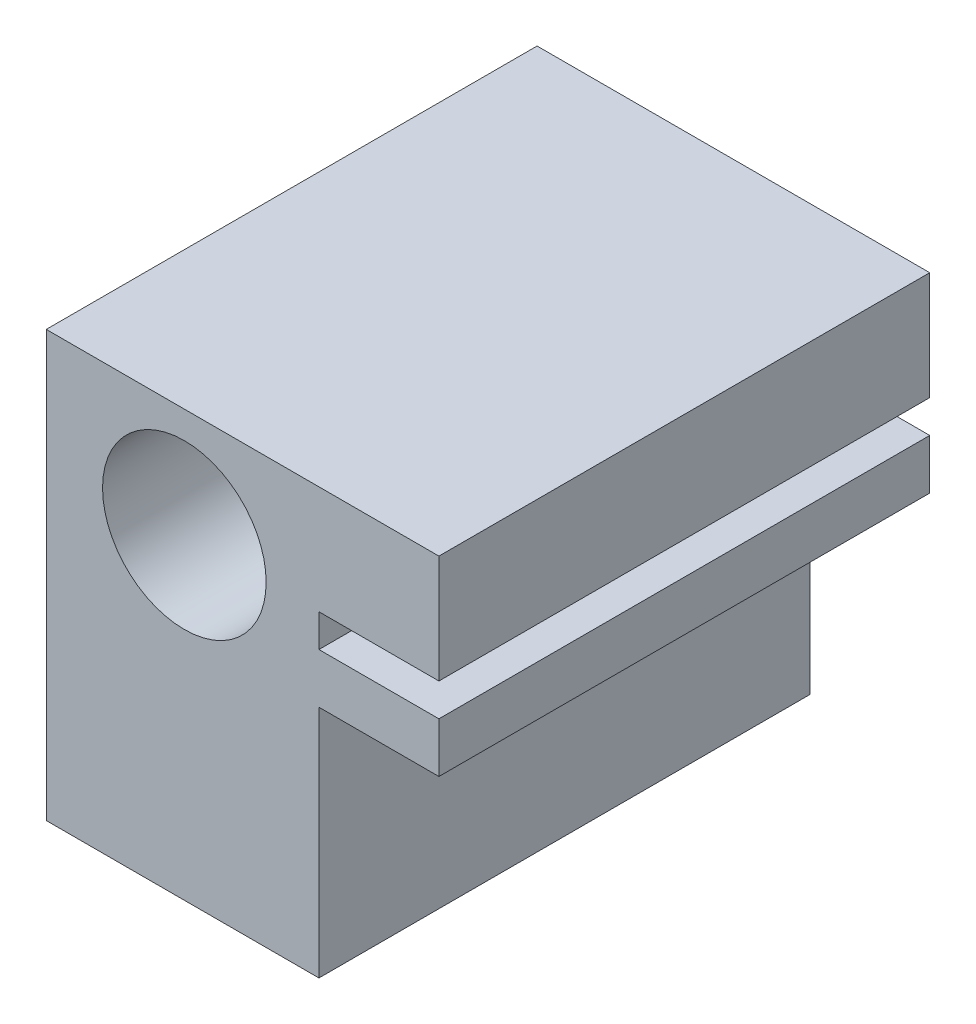
ISO-10303-21;
HEADER;
FILE_DESCRIPTION(('STEP AP214'),'2;1');
FILE_NAME('part.step','',(''),(''),'','','');
FILE_SCHEMA(('AUTOMOTIVE_DESIGN { 1 0 10303 214 1 1 1 1 }'));
ENDSEC;
DATA;
#1=APPLICATION_CONTEXT('core data for automotive mechanical design processes');
#2=APPLICATION_PROTOCOL_DEFINITION('international standard','automotive_design',2000,#1);
#3=PRODUCT_CONTEXT('',#1,'mechanical');
#4=PRODUCT('Part','Part','',(#3));
#5=PRODUCT_RELATED_PRODUCT_CATEGORY('part','',(#4));
#6=PRODUCT_DEFINITION_FORMATION('','',#4);
#7=PRODUCT_DEFINITION_CONTEXT('part definition',#1,'design');
#8=PRODUCT_DEFINITION('design','',#6,#7);
#9=PRODUCT_DEFINITION_SHAPE('','',#8);
#10=(LENGTH_UNIT() NAMED_UNIT(*) SI_UNIT(.MILLI.,.METRE.));
#11=(NAMED_UNIT(*) PLANE_ANGLE_UNIT() SI_UNIT($,.RADIAN.));
#12=(NAMED_UNIT(*) SI_UNIT($,.STERADIAN.) SOLID_ANGLE_UNIT());
#13=UNCERTAINTY_MEASURE_WITH_UNIT(LENGTH_MEASURE(1.E-05),#10,'distance_accuracy_value','');
#14=(GEOMETRIC_REPRESENTATION_CONTEXT(3) GLOBAL_UNCERTAINTY_ASSIGNED_CONTEXT((#13)) GLOBAL_UNIT_ASSIGNED_CONTEXT((#10,
#11,#12)) REPRESENTATION_CONTEXT('',''));
#15=CARTESIAN_POINT('',(0.,0.,0.));
#16=DIRECTION('',(0.,0.,1.));
#17=DIRECTION('',(1.,0.,0.));
#18=AXIS2_PLACEMENT_3D('',#15,#16,#17);
#19=CARTESIAN_POINT('',(16.,0.,0.));
#20=DIRECTION('',(-1.,0.,0.));
#21=DIRECTION('',(0.,-1.,0.));
#22=AXIS2_PLACEMENT_3D('',#19,#20,#21);
#23=PLANE('',#22);
#24=DIRECTION('',(0.,1.,0.));
#25=VECTOR('',#24,1.);
#26=CARTESIAN_POINT('',(16.,0.,-45.));
#27=LINE('',#26,#25);
#28=CARTESIAN_POINT('',(16.,19.0799999999999,-45.));
#29=VERTEX_POINT('',#28);
#30=CARTESIAN_POINT('',(16.,29.,-45.));
#31=VERTEX_POINT('',#30);
#32=EDGE_CURVE('E155',#29,#31,#27,.T.);
#33=ORIENTED_EDGE('',*,*,#32,.T.);
#34=DIRECTION('',(0.,0.,1.));
#35=VECTOR('',#34,1.);
#36=CARTESIAN_POINT('',(16.,29.,-45.));
#37=LINE('',#36,#35);
#38=CARTESIAN_POINT('',(16.,29.,0.));
#39=VERTEX_POINT('',#38);
#40=EDGE_CURVE('E40',#31,#39,#37,.T.);
#41=ORIENTED_EDGE('',*,*,#40,.T.);
#42=DIRECTION('',(0.,1.,0.));
#43=VECTOR('',#42,1.);
#44=CARTESIAN_POINT('',(16.,0.,0.));
#45=LINE('',#44,#43);
#46=CARTESIAN_POINT('',(16.,19.0799999999999,0.));
#47=VERTEX_POINT('',#46);
#48=EDGE_CURVE('E151',#47,#39,#45,.T.);
#49=ORIENTED_EDGE('',*,*,#48,.F.);
#50=DIRECTION('',(0.,0.,-1.));
#51=VECTOR('',#50,1.);
#52=CARTESIAN_POINT('',(16.,19.0799999999999,0.));
#53=LINE('',#52,#51);
#54=EDGE_CURVE('E11',#47,#29,#53,.T.);
#55=ORIENTED_EDGE('',*,*,#54,.T.);
#56=EDGE_LOOP('',(#33,#41,#49,#55));
#57=FACE_BOUND('',#56,.T.);
#58=ADVANCED_FACE('F36',(#57),#23,.F.);
#59=DIRECTION('',(0.,0.,-1.));
#60=VECTOR('',#59,1.);
#61=CARTESIAN_POINT('',(16.,11.4999999999999,0.));
#62=LINE('',#61,#60);
#63=CARTESIAN_POINT('',(16.,11.4999999999999,0.));
#64=VERTEX_POINT('',#63);
#65=CARTESIAN_POINT('',(16.,11.4999999999999,-45.));
#66=VERTEX_POINT('',#65);
#67=EDGE_CURVE('E45',#64,#66,#62,.T.);
#68=ORIENTED_EDGE('',*,*,#67,.T.);
#69=CARTESIAN_POINT('',(16.,16.0799999999999,-45.));
#70=VERTEX_POINT('',#69);
#71=EDGE_CURVE('E156',#66,#70,#27,.T.);
#72=ORIENTED_EDGE('',*,*,#71,.T.);
#73=DIRECTION('',(0.,0.,-1.));
#74=VECTOR('',#73,1.);
#75=CARTESIAN_POINT('',(16.,16.0799999999999,0.));
#76=LINE('',#75,#74);
#77=CARTESIAN_POINT('',(16.,16.0799999999999,0.));
#78=VERTEX_POINT('',#77);
#79=EDGE_CURVE('E204',#78,#70,#76,.T.);
#80=ORIENTED_EDGE('',*,*,#79,.F.);
#81=EDGE_CURVE('E157',#64,#78,#45,.T.);
#82=ORIENTED_EDGE('',*,*,#81,.F.);
#83=EDGE_LOOP('',(#68,#72,#80,#82));
#84=FACE_BOUND('',#83,.T.);
#85=ADVANCED_FACE('F38',(#84),#23,.F.);
#86=CARTESIAN_POINT('',(-7.33999999999951,6.99999999999999,-33.75));
#87=DIRECTION('',(0.,-1.,0.));
#88=DIRECTION('',(1.,0.,0.));
#89=AXIS2_PLACEMENT_3D('',#86,#87,#88);
#90=PLANE('',#89);
#91=CARTESIAN_POINT('',(-7.33999999999951,6.99999999999999,-33.75));
#92=DIRECTION('',(0.,-1.,0.));
#93=DIRECTION('',(1.,0.,0.));
#94=AXIS2_PLACEMENT_3D('',#91,#92,#93);
#95=CIRCLE('',#94,4.);
#96=CARTESIAN_POINT('',(-3.33999999999951,6.99999999999999,-33.75));
#97=VERTEX_POINT('',#96);
#98=EDGE_CURVE('E187',#97,#97,#95,.T.);
#99=ORIENTED_EDGE('',*,*,#98,.T.);
#100=EDGE_LOOP('',(#99));
#101=FACE_BOUND('',#100,.T.);
#102=ADVANCED_FACE('F247',(#101),#90,.T.);
#103=CARTESIAN_POINT('',(-7.33999999999951,6.99999999999999,-11.25));
#104=DIRECTION('',(0.,-1.,0.));
#105=DIRECTION('',(1.,0.,0.));
#106=AXIS2_PLACEMENT_3D('',#103,#104,#105);
#107=PLANE('',#106);
#108=CARTESIAN_POINT('',(-7.33999999999951,6.99999999999999,-11.25));
#109=DIRECTION('',(0.,-1.,0.));
#110=DIRECTION('',(1.,0.,0.));
#111=AXIS2_PLACEMENT_3D('',#108,#109,#110);
#112=CIRCLE('',#111,4.);
#113=CARTESIAN_POINT('',(-3.33999999999952,6.99999999999999,-11.25));
#114=VERTEX_POINT('',#113);
#115=EDGE_CURVE('E184',#114,#114,#112,.T.);
#116=ORIENTED_EDGE('',*,*,#115,.T.);
#117=EDGE_LOOP('',(#116));
#118=FACE_BOUND('',#117,.T.);
#119=ADVANCED_FACE('F312',(#118),#107,.T.);
#120=CARTESIAN_POINT('',(-7.33999999999951,6.99999999999999,-33.75));
#121=DIRECTION('',(0.,-1.,0.));
#122=DIRECTION('',(1.,0.,0.));
#123=AXIS2_PLACEMENT_3D('',#120,#121,#122);
#124=CYLINDRICAL_SURFACE('',#123,4.);
#125=ORIENTED_EDGE('',*,*,#98,.F.);
#126=EDGE_LOOP('',(#125));
#127=FACE_BOUND('',#126,.T.);
#128=CARTESIAN_POINT('',(-7.33999999999951,-10.,-33.75));
#129=DIRECTION('',(0.,-1.,0.));
#130=DIRECTION('',(1.,0.,0.));
#131=AXIS2_PLACEMENT_3D('',#128,#129,#130);
#132=CIRCLE('',#131,4.);
#133=CARTESIAN_POINT('',(-3.3399999999995,-10.,-33.75));
#134=VERTEX_POINT('',#133);
#135=EDGE_CURVE('E190',#134,#134,#132,.T.);
#136=ORIENTED_EDGE('',*,*,#135,.T.);
#137=EDGE_LOOP('',(#136));
#138=FACE_BOUND('',#137,.T.);
#139=ADVANCED_FACE('F336',(#127,#138),#124,.F.);
#140=CARTESIAN_POINT('',(-7.33999999999951,6.99999999999999,-11.25));
#141=DIRECTION('',(0.,-1.,0.));
#142=DIRECTION('',(1.,0.,0.));
#143=AXIS2_PLACEMENT_3D('',#140,#141,#142);
#144=CYLINDRICAL_SURFACE('',#143,4.);
#145=ORIENTED_EDGE('',*,*,#115,.F.);
#146=EDGE_LOOP('',(#145));
#147=FACE_BOUND('',#146,.T.);
#148=CARTESIAN_POINT('',(-7.33999999999951,-10.,-11.25));
#149=DIRECTION('',(0.,-1.,0.));
#150=DIRECTION('',(1.,0.,0.));
#151=AXIS2_PLACEMENT_3D('',#148,#149,#150);
#152=CIRCLE('',#151,4.);
#153=CARTESIAN_POINT('',(-3.33999999999951,-10.,-11.25));
#154=VERTEX_POINT('',#153);
#155=EDGE_CURVE('E193',#154,#154,#152,.T.);
#156=ORIENTED_EDGE('',*,*,#155,.T.);
#157=EDGE_LOOP('',(#156));
#158=FACE_BOUND('',#157,.T.);
#159=ADVANCED_FACE('F343',(#147,#158),#144,.F.);
#160=CARTESIAN_POINT('',(-7.34,19.,-45.));
#161=DIRECTION('',(0.,0.,1.));
#162=DIRECTION('',(1.,0.,0.));
#163=AXIS2_PLACEMENT_3D('',#160,#161,#162);
#164=CYLINDRICAL_SURFACE('',#163,7.49999999999999);
#165=CARTESIAN_POINT('',(-7.34,19.,-45.));
#166=DIRECTION('',(0.,0.,1.));
#167=DIRECTION('',(1.,0.,0.));
#168=AXIS2_PLACEMENT_3D('',#165,#166,#167);
#169=CIRCLE('',#168,7.49999999999999);
#170=CARTESIAN_POINT('',(0.159999999999993,19.,-45.));
#171=VERTEX_POINT('',#170);
#172=EDGE_CURVE('E144',#171,#171,#169,.T.);
#173=ORIENTED_EDGE('',*,*,#172,.F.);
#174=EDGE_LOOP('',(#173));
#175=FACE_BOUND('',#174,.T.);
#176=CARTESIAN_POINT('',(-7.34,19.,0.));
#177=DIRECTION('',(0.,0.,1.));
#178=DIRECTION('',(1.,0.,0.));
#179=AXIS2_PLACEMENT_3D('',#176,#177,#178);
#180=CIRCLE('',#179,7.49999999999999);
#181=CARTESIAN_POINT('',(0.159999999999993,19.,0.));
#182=VERTEX_POINT('',#181);
#183=EDGE_CURVE('E181',#182,#182,#180,.T.);
#184=ORIENTED_EDGE('',*,*,#183,.T.);
#185=EDGE_LOOP('',(#184));
#186=FACE_BOUND('',#185,.T.);
#187=ADVANCED_FACE('F347',(#175,#186),#164,.F.);
#188=CARTESIAN_POINT('',(20.,-10.,-45.));
#189=DIRECTION('',(0.,-1.,0.));
#190=DIRECTION('',(1.,0.,0.));
#191=AXIS2_PLACEMENT_3D('',#188,#189,#190);
#192=PLANE('',#191);
#193=DIRECTION('',(0.,0.,-1.));
#194=VECTOR('',#193,1.);
#195=CARTESIAN_POINT('',(5.,-10.,0.));
#196=LINE('',#195,#194);
#197=CARTESIAN_POINT('',(5.,-10.,0.));
#198=VERTEX_POINT('',#197);
#199=CARTESIAN_POINT('',(5.,-10.,-45.));
#200=VERTEX_POINT('',#199);
#201=EDGE_CURVE('E117',#198,#200,#196,.T.);
#202=ORIENTED_EDGE('',*,*,#201,.F.);
#203=DIRECTION('',(1.,0.,0.));
#204=VECTOR('',#203,1.);
#205=CARTESIAN_POINT('',(20.,-10.,0.));
#206=LINE('',#205,#204);
#207=CARTESIAN_POINT('',(-20.,-10.,0.));
#208=VERTEX_POINT('',#207);
#209=EDGE_CURVE('E131',#208,#198,#206,.T.);
#210=ORIENTED_EDGE('',*,*,#209,.F.);
#211=DIRECTION('',(0.,0.,1.));
#212=VECTOR('',#211,1.);
#213=CARTESIAN_POINT('',(-20.,-10.,-45.));
#214=LINE('',#213,#212);
#215=CARTESIAN_POINT('',(-20.,-10.,-45.));
#216=VERTEX_POINT('',#215);
#217=EDGE_CURVE('E152',#216,#208,#214,.T.);
#218=ORIENTED_EDGE('',*,*,#217,.F.);
#219=DIRECTION('',(1.,0.,0.));
#220=VECTOR('',#219,1.);
#221=CARTESIAN_POINT('',(20.,-10.,-45.));
#222=LINE('',#221,#220);
#223=EDGE_CURVE('E134',#216,#200,#222,.T.);
#224=ORIENTED_EDGE('',*,*,#223,.T.);
#225=EDGE_LOOP('',(#202,#210,#218,#224));
#226=FACE_BOUND('',#225,.T.);
#227=ORIENTED_EDGE('',*,*,#155,.F.);
#228=EDGE_LOOP('',(#227));
#229=FACE_BOUND('',#228,.T.);
#230=ORIENTED_EDGE('',*,*,#135,.F.);
#231=EDGE_LOOP('',(#230));
#232=FACE_BOUND('',#231,.T.);
#233=ADVANCED_FACE('F129',(#226,#229,#232),#192,.T.);
#234=CARTESIAN_POINT('',(-20.,29.,-45.));
#235=DIRECTION('',(-1.,0.,0.));
#236=DIRECTION('',(0.,-1.,0.));
#237=AXIS2_PLACEMENT_3D('',#234,#235,#236);
#238=PLANE('',#237);
#239=DIRECTION('',(0.,-1.,0.));
#240=VECTOR('',#239,1.);
#241=CARTESIAN_POINT('',(-20.,29.,0.));
#242=LINE('',#241,#240);
#243=CARTESIAN_POINT('',(-20.,29.,0.));
#244=VERTEX_POINT('',#243);
#245=EDGE_CURVE('E139',#244,#208,#242,.T.);
#246=ORIENTED_EDGE('',*,*,#245,.F.);
#247=DIRECTION('',(0.,0.,1.));
#248=VECTOR('',#247,1.);
#249=CARTESIAN_POINT('',(-20.,29.,-45.));
#250=LINE('',#249,#248);
#251=CARTESIAN_POINT('',(-20.,29.,-45.));
#252=VERTEX_POINT('',#251);
#253=EDGE_CURVE('E148',#252,#244,#250,.T.);
#254=ORIENTED_EDGE('',*,*,#253,.F.);
#255=DIRECTION('',(0.,-1.,0.));
#256=VECTOR('',#255,1.);
#257=CARTESIAN_POINT('',(-20.,29.,-45.));
#258=LINE('',#257,#256);
#259=EDGE_CURVE('E142',#252,#216,#258,.T.);
#260=ORIENTED_EDGE('',*,*,#259,.T.);
#261=ORIENTED_EDGE('',*,*,#217,.T.);
#262=EDGE_LOOP('',(#246,#254,#260,#261));
#263=FACE_BOUND('',#262,.T.);
#264=ADVANCED_FACE('F172',(#263),#238,.T.);
#265=CARTESIAN_POINT('',(20.,29.,-45.));
#266=DIRECTION('',(0.,1.,0.));
#267=DIRECTION('',(-1.,0.,0.));
#268=AXIS2_PLACEMENT_3D('',#265,#266,#267);
#269=PLANE('',#268);
#270=ORIENTED_EDGE('',*,*,#40,.F.);
#271=DIRECTION('',(-1.,0.,0.));
#272=VECTOR('',#271,1.);
#273=CARTESIAN_POINT('',(20.,29.,-45.));
#274=LINE('',#273,#272);
#275=EDGE_CURVE('E154',#31,#252,#274,.T.);
#276=ORIENTED_EDGE('',*,*,#275,.T.);
#277=ORIENTED_EDGE('',*,*,#253,.T.);
#278=DIRECTION('',(-1.,0.,0.));
#279=VECTOR('',#278,1.);
#280=CARTESIAN_POINT('',(20.,29.,0.));
#281=LINE('',#280,#279);
#282=EDGE_CURVE('E140',#39,#244,#281,.T.);
#283=ORIENTED_EDGE('',*,*,#282,.F.);
#284=EDGE_LOOP('',(#270,#276,#277,#283));
#285=FACE_BOUND('',#284,.T.);
#286=ADVANCED_FACE('F167',(#285),#269,.T.);
#287=CARTESIAN_POINT('',(5.,19.0799999999999,0.));
#288=DIRECTION('',(-1.,0.,0.));
#289=DIRECTION('',(0.,-1.,0.));
#290=AXIS2_PLACEMENT_3D('',#287,#288,#289);
#291=PLANE('',#290);
#292=DIRECTION('',(0.,1.,0.));
#293=VECTOR('',#292,1.);
#294=CARTESIAN_POINT('',(5.,19.0799999999999,-45.));
#295=LINE('',#294,#293);
#296=CARTESIAN_POINT('',(5.,16.0799999999999,-45.));
#297=VERTEX_POINT('',#296);
#298=CARTESIAN_POINT('',(5.,19.0799999999999,-45.));
#299=VERTEX_POINT('',#298);
#300=EDGE_CURVE('E208',#297,#299,#295,.T.);
#301=ORIENTED_EDGE('',*,*,#300,.T.);
#302=DIRECTION('',(0.,0.,-1.));
#303=VECTOR('',#302,1.);
#304=CARTESIAN_POINT('',(5.,19.0799999999999,0.));
#305=LINE('',#304,#303);
#306=CARTESIAN_POINT('',(5.,19.0799999999999,0.));
#307=VERTEX_POINT('',#306);
#308=EDGE_CURVE('E212',#307,#299,#305,.T.);
#309=ORIENTED_EDGE('',*,*,#308,.F.);
#310=DIRECTION('',(0.,1.,0.));
#311=VECTOR('',#310,1.);
#312=CARTESIAN_POINT('',(5.,19.0799999999999,0.));
#313=LINE('',#312,#311);
#314=CARTESIAN_POINT('',(5.,16.0799999999999,0.));
#315=VERTEX_POINT('',#314);
#316=EDGE_CURVE('E201',#315,#307,#313,.T.);
#317=ORIENTED_EDGE('',*,*,#316,.F.);
#318=DIRECTION('',(0.,0.,-1.));
#319=VECTOR('',#318,1.);
#320=CARTESIAN_POINT('',(5.,16.0799999999999,0.));
#321=LINE('',#320,#319);
#322=EDGE_CURVE('E214',#315,#297,#321,.T.);
#323=ORIENTED_EDGE('',*,*,#322,.T.);
#324=EDGE_LOOP('',(#301,#309,#317,#323));
#325=FACE_BOUND('',#324,.T.);
#326=ADVANCED_FACE('F234',(#325),#291,.F.);
#327=CARTESIAN_POINT('',(5.,-10.,0.));
#328=DIRECTION('',(-1.,0.,0.));
#329=DIRECTION('',(0.,0.,1.));
#330=AXIS2_PLACEMENT_3D('',#327,#328,#329);
#331=PLANE('',#330);
#332=DIRECTION('',(0.,1.,0.));
#333=VECTOR('',#332,1.);
#334=CARTESIAN_POINT('',(5.,-10.,-45.));
#335=LINE('',#334,#333);
#336=CARTESIAN_POINT('',(5.,11.4999999999999,-45.));
#337=VERTEX_POINT('',#336);
#338=EDGE_CURVE('E177',#200,#337,#335,.T.);
#339=ORIENTED_EDGE('',*,*,#338,.T.);
#340=DIRECTION('',(0.,0.,-1.));
#341=VECTOR('',#340,1.);
#342=CARTESIAN_POINT('',(5.,11.4999999999999,0.));
#343=LINE('',#342,#341);
#344=CARTESIAN_POINT('',(5.,11.4999999999999,0.));
#345=VERTEX_POINT('',#344);
#346=EDGE_CURVE('E119',#345,#337,#343,.T.);
#347=ORIENTED_EDGE('',*,*,#346,.F.);
#348=DIRECTION('',(0.,1.,0.));
#349=VECTOR('',#348,1.);
#350=CARTESIAN_POINT('',(5.,-10.,0.));
#351=LINE('',#350,#349);
#352=EDGE_CURVE('E113',#198,#345,#351,.T.);
#353=ORIENTED_EDGE('',*,*,#352,.F.);
#354=ORIENTED_EDGE('',*,*,#201,.T.);
#355=EDGE_LOOP('',(#339,#347,#353,#354));
#356=FACE_BOUND('',#355,.T.);
#357=ADVANCED_FACE('F116',(#356),#331,.F.);
#358=CARTESIAN_POINT('',(0.,0.,0.));
#359=DIRECTION('',(0.,0.,-1.));
#360=DIRECTION('',(-1.,0.,0.));
#361=AXIS2_PLACEMENT_3D('',#358,#359,#360);
#362=PLANE('',#361);
#363=DIRECTION('',(1.,0.,0.));
#364=VECTOR('',#363,1.);
#365=CARTESIAN_POINT('',(16.,11.4999999999999,0.));
#366=LINE('',#365,#364);
#367=EDGE_CURVE('E123',#345,#64,#366,.T.);
#368=ORIENTED_EDGE('',*,*,#367,.T.);
#369=ORIENTED_EDGE('',*,*,#81,.T.);
#370=DIRECTION('',(-1.,0.,0.));
#371=VECTOR('',#370,1.);
#372=CARTESIAN_POINT('',(16.,16.0799999999999,0.));
#373=LINE('',#372,#371);
#374=EDGE_CURVE('E198',#78,#315,#373,.T.);
#375=ORIENTED_EDGE('',*,*,#374,.T.);
#376=ORIENTED_EDGE('',*,*,#316,.T.);
#377=DIRECTION('',(1.,0.,0.));
#378=VECTOR('',#377,1.);
#379=CARTESIAN_POINT('',(16.,19.0799999999999,0.));
#380=LINE('',#379,#378);
#381=EDGE_CURVE('E164',#307,#47,#380,.T.);
#382=ORIENTED_EDGE('',*,*,#381,.T.);
#383=ORIENTED_EDGE('',*,*,#48,.T.);
#384=ORIENTED_EDGE('',*,*,#282,.T.);
#385=ORIENTED_EDGE('',*,*,#245,.T.);
#386=ORIENTED_EDGE('',*,*,#209,.T.);
#387=ORIENTED_EDGE('',*,*,#352,.T.);
#388=EDGE_LOOP('',(#368,#369,#375,#376,#382,#383,#384,#385,#386,#387));
#389=FACE_BOUND('',#388,.T.);
#390=ORIENTED_EDGE('',*,*,#183,.F.);
#391=EDGE_LOOP('',(#390));
#392=FACE_BOUND('',#391,.T.);
#393=ADVANCED_FACE('F136',(#389,#392),#362,.F.);
#394=CARTESIAN_POINT('',(0.,0.,-45.));
#395=DIRECTION('',(0.,0.,-1.));
#396=DIRECTION('',(-1.,0.,0.));
#397=AXIS2_PLACEMENT_3D('',#394,#395,#396);
#398=PLANE('',#397);
#399=ORIENTED_EDGE('',*,*,#71,.F.);
#400=DIRECTION('',(1.,0.,0.));
#401=VECTOR('',#400,1.);
#402=CARTESIAN_POINT('',(16.,11.4999999999999,-45.));
#403=LINE('',#402,#401);
#404=EDGE_CURVE('E124',#337,#66,#403,.T.);
#405=ORIENTED_EDGE('',*,*,#404,.F.);
#406=ORIENTED_EDGE('',*,*,#338,.F.);
#407=ORIENTED_EDGE('',*,*,#223,.F.);
#408=ORIENTED_EDGE('',*,*,#259,.F.);
#409=ORIENTED_EDGE('',*,*,#275,.F.);
#410=ORIENTED_EDGE('',*,*,#32,.F.);
#411=DIRECTION('',(1.,0.,0.));
#412=VECTOR('',#411,1.);
#413=CARTESIAN_POINT('',(16.,19.0799999999999,-45.));
#414=LINE('',#413,#412);
#415=EDGE_CURVE('E200',#299,#29,#414,.T.);
#416=ORIENTED_EDGE('',*,*,#415,.F.);
#417=ORIENTED_EDGE('',*,*,#300,.F.);
#418=DIRECTION('',(-1.,0.,0.));
#419=VECTOR('',#418,1.);
#420=CARTESIAN_POINT('',(16.,16.0799999999999,-45.));
#421=LINE('',#420,#419);
#422=EDGE_CURVE('E205',#70,#297,#421,.T.);
#423=ORIENTED_EDGE('',*,*,#422,.F.);
#424=EDGE_LOOP('',(#399,#405,#406,#407,#408,#409,#410,#416,#417,#423));
#425=FACE_BOUND('',#424,.T.);
#426=ORIENTED_EDGE('',*,*,#172,.T.);
#427=EDGE_LOOP('',(#426));
#428=FACE_BOUND('',#427,.T.);
#429=ADVANCED_FACE('F174',(#425,#428),#398,.T.);
#430=CARTESIAN_POINT('',(16.,11.4999999999999,0.));
#431=DIRECTION('',(0.,1.,0.));
#432=DIRECTION('',(0.,0.,1.));
#433=AXIS2_PLACEMENT_3D('',#430,#431,#432);
#434=PLANE('',#433);
#435=ORIENTED_EDGE('',*,*,#404,.T.);
#436=ORIENTED_EDGE('',*,*,#67,.F.);
#437=ORIENTED_EDGE('',*,*,#367,.F.);
#438=ORIENTED_EDGE('',*,*,#346,.T.);
#439=EDGE_LOOP('',(#435,#436,#437,#438));
#440=FACE_BOUND('',#439,.T.);
#441=ADVANCED_FACE('F225',(#440),#434,.F.);
#442=CARTESIAN_POINT('',(16.,16.0799999999999,0.));
#443=DIRECTION('',(0.,-1.,0.));
#444=DIRECTION('',(0.,0.,-1.));
#445=AXIS2_PLACEMENT_3D('',#442,#443,#444);
#446=PLANE('',#445);
#447=ORIENTED_EDGE('',*,*,#422,.T.);
#448=ORIENTED_EDGE('',*,*,#322,.F.);
#449=ORIENTED_EDGE('',*,*,#374,.F.);
#450=ORIENTED_EDGE('',*,*,#79,.T.);
#451=EDGE_LOOP('',(#447,#448,#449,#450));
#452=FACE_BOUND('',#451,.T.);
#453=ADVANCED_FACE('F232',(#452),#446,.F.);
#454=CARTESIAN_POINT('',(16.,19.0799999999999,0.));
#455=DIRECTION('',(0.,1.,0.));
#456=DIRECTION('',(0.,0.,1.));
#457=AXIS2_PLACEMENT_3D('',#454,#455,#456);
#458=PLANE('',#457);
#459=ORIENTED_EDGE('',*,*,#415,.T.);
#460=ORIENTED_EDGE('',*,*,#54,.F.);
#461=ORIENTED_EDGE('',*,*,#381,.F.);
#462=ORIENTED_EDGE('',*,*,#308,.T.);
#463=EDGE_LOOP('',(#459,#460,#461,#462));
#464=FACE_BOUND('',#463,.T.);
#465=ADVANCED_FACE('F237',(#464),#458,.F.);
#466=CLOSED_SHELL('',(#58,#85,#102,#119,#139,#159,#187,#233,#264,#286,#326,#357,#393,#429,#441,
#453,#465));
#467=MANIFOLD_SOLID_BREP('B2',#466);
#468=ADVANCED_BREP_SHAPE_REPRESENTATION('',(#18,#467),#14);
#469=SHAPE_DEFINITION_REPRESENTATION(#9,#468);
ENDSEC;
END-ISO-10303-21;
